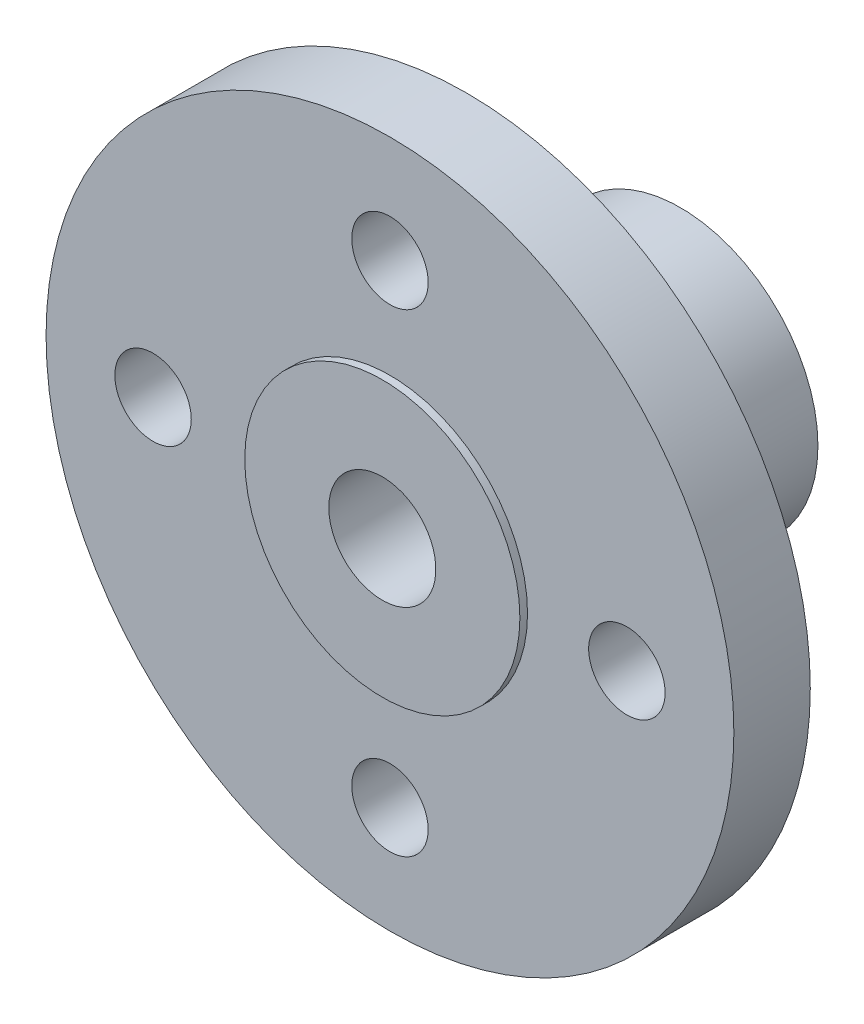
ISO-10303-21;
HEADER;
FILE_DESCRIPTION(('STEP AP214'),'2;1');
FILE_NAME('part.step','',(''),(''),'','','');
FILE_SCHEMA(('AUTOMOTIVE_DESIGN { 1 0 10303 214 1 1 1 1 }'));
ENDSEC;
DATA;
#1=APPLICATION_CONTEXT('core data for automotive mechanical design processes');
#2=APPLICATION_PROTOCOL_DEFINITION('international standard','automotive_design',2000,#1);
#3=PRODUCT_CONTEXT('',#1,'mechanical');
#4=PRODUCT('Part','Part','',(#3));
#5=PRODUCT_RELATED_PRODUCT_CATEGORY('part','',(#4));
#6=PRODUCT_DEFINITION_FORMATION('','',#4);
#7=PRODUCT_DEFINITION_CONTEXT('part definition',#1,'design');
#8=PRODUCT_DEFINITION('design','',#6,#7);
#9=PRODUCT_DEFINITION_SHAPE('','',#8);
#10=(LENGTH_UNIT() NAMED_UNIT(*) SI_UNIT(.MILLI.,.METRE.));
#11=(NAMED_UNIT(*) PLANE_ANGLE_UNIT() SI_UNIT($,.RADIAN.));
#12=(NAMED_UNIT(*) SI_UNIT($,.STERADIAN.) SOLID_ANGLE_UNIT());
#13=UNCERTAINTY_MEASURE_WITH_UNIT(LENGTH_MEASURE(1.E-05),#10,'distance_accuracy_value','');
#14=(GEOMETRIC_REPRESENTATION_CONTEXT(3) GLOBAL_UNCERTAINTY_ASSIGNED_CONTEXT((#13)) GLOBAL_UNIT_ASSIGNED_CONTEXT((#10,
#11,#12)) REPRESENTATION_CONTEXT('',''));
#15=CARTESIAN_POINT('',(0.,0.,0.));
#16=DIRECTION('',(0.,0.,1.));
#17=DIRECTION('',(1.,0.,0.));
#18=AXIS2_PLACEMENT_3D('',#15,#16,#17);
#19=CARTESIAN_POINT('',(0.,0.,2.2));
#20=DIRECTION('',(0.,0.,-1.));
#21=DIRECTION('',(-1.,0.,0.));
#22=AXIS2_PLACEMENT_3D('',#19,#20,#21);
#23=CYLINDRICAL_SURFACE('',#22,3.6);
#24=CARTESIAN_POINT('',(0.,0.,-5.6));
#25=DIRECTION('',(0.,0.,-1.));
#26=DIRECTION('',(-1.,0.,0.));
#27=AXIS2_PLACEMENT_3D('',#24,#25,#26);
#28=CIRCLE('',#27,3.6);
#29=CARTESIAN_POINT('',(-3.6,0.,-5.6));
#30=VERTEX_POINT('',#29);
#31=EDGE_CURVE('E83',#30,#30,#28,.T.);
#32=ORIENTED_EDGE('',*,*,#31,.F.);
#33=EDGE_LOOP('',(#32));
#34=FACE_BOUND('',#33,.T.);
#35=CARTESIAN_POINT('',(0.,0.,0.));
#36=DIRECTION('',(0.,0.,1.));
#37=DIRECTION('',(1.,0.,0.));
#38=AXIS2_PLACEMENT_3D('',#35,#36,#37);
#39=CIRCLE('',#38,3.6);
#40=CARTESIAN_POINT('',(3.6,0.,0.));
#41=VERTEX_POINT('',#40);
#42=EDGE_CURVE('E56',#41,#41,#39,.T.);
#43=ORIENTED_EDGE('',*,*,#42,.F.);
#44=EDGE_LOOP('',(#43));
#45=FACE_BOUND('',#44,.T.);
#46=ADVANCED_FACE('F30',(#34,#45),#23,.T.);
#47=CARTESIAN_POINT('',(0.,0.,2.));
#48=DIRECTION('',(0.,0.,1.));
#49=DIRECTION('',(1.,0.,0.));
#50=AXIS2_PLACEMENT_3D('',#47,#48,#49);
#51=CIRCLE('',#50,3.6);
#52=CARTESIAN_POINT('',(3.6,0.,2.));
#53=VERTEX_POINT('',#52);
#54=EDGE_CURVE('E10',#53,#53,#51,.T.);
#55=ORIENTED_EDGE('',*,*,#54,.T.);
#56=EDGE_LOOP('',(#55));
#57=FACE_BOUND('',#56,.T.);
#58=CARTESIAN_POINT('',(0.,0.,2.2));
#59=DIRECTION('',(0.,0.,-1.));
#60=DIRECTION('',(-1.,0.,0.));
#61=AXIS2_PLACEMENT_3D('',#58,#59,#60);
#62=CIRCLE('',#61,3.6);
#63=CARTESIAN_POINT('',(-3.6,0.,2.2));
#64=VERTEX_POINT('',#63);
#65=EDGE_CURVE('E47',#64,#64,#62,.T.);
#66=ORIENTED_EDGE('',*,*,#65,.T.);
#67=EDGE_LOOP('',(#66));
#68=FACE_BOUND('',#67,.T.);
#69=ADVANCED_FACE('F109',(#57,#68),#23,.T.);
#70=CARTESIAN_POINT('',(0.,0.,2.2));
#71=DIRECTION('',(0.,0.,-1.));
#72=DIRECTION('',(-1.,0.,0.));
#73=AXIS2_PLACEMENT_3D('',#70,#71,#72);
#74=PLANE('',#73);
#75=CARTESIAN_POINT('',(0.,0.,2.2));
#76=DIRECTION('',(0.,0.,-1.));
#77=DIRECTION('',(-1.,0.,0.));
#78=AXIS2_PLACEMENT_3D('',#75,#76,#77);
#79=CIRCLE('',#78,1.4);
#80=CARTESIAN_POINT('',(-1.4,0.,2.2));
#81=VERTEX_POINT('',#80);
#82=EDGE_CURVE('E79',#81,#81,#79,.T.);
#83=ORIENTED_EDGE('',*,*,#82,.T.);
#84=EDGE_LOOP('',(#83));
#85=FACE_BOUND('',#84,.T.);
#86=ORIENTED_EDGE('',*,*,#65,.F.);
#87=EDGE_LOOP('',(#86));
#88=FACE_BOUND('',#87,.T.);
#89=ADVANCED_FACE('F114',(#85,#88),#74,.F.);
#90=CARTESIAN_POINT('',(0.,0.,2.2));
#91=DIRECTION('',(0.,0.,-1.));
#92=DIRECTION('',(-1.,0.,0.));
#93=AXIS2_PLACEMENT_3D('',#90,#91,#92);
#94=CYLINDRICAL_SURFACE('',#93,1.4);
#95=CARTESIAN_POINT('',(0.,0.,0.));
#96=DIRECTION('',(0.,0.,1.));
#97=DIRECTION('',(1.,0.,0.));
#98=AXIS2_PLACEMENT_3D('',#95,#96,#97);
#99=CIRCLE('',#98,1.4);
#100=CARTESIAN_POINT('',(1.4,0.,0.));
#101=VERTEX_POINT('',#100);
#102=EDGE_CURVE('E34',#101,#101,#99,.F.);
#103=ORIENTED_EDGE('',*,*,#102,.T.);
#104=EDGE_LOOP('',(#103));
#105=FACE_BOUND('',#104,.T.);
#106=ORIENTED_EDGE('',*,*,#82,.F.);
#107=EDGE_LOOP('',(#106));
#108=FACE_BOUND('',#107,.T.);
#109=ADVANCED_FACE('F103',(#105,#108),#94,.F.);
#110=CARTESIAN_POINT('',(0.,0.,-5.6));
#111=DIRECTION('',(0.,0.,-1.));
#112=DIRECTION('',(-1.,0.,0.));
#113=AXIS2_PLACEMENT_3D('',#110,#111,#112);
#114=PLANE('',#113);
#115=CARTESIAN_POINT('',(0.,0.,-5.6));
#116=DIRECTION('',(0.,0.,-1.));
#117=DIRECTION('',(-1.,0.,0.));
#118=AXIS2_PLACEMENT_3D('',#115,#116,#117);
#119=CIRCLE('',#118,2.75);
#120=CARTESIAN_POINT('',(-2.75,0.,-5.6));
#121=VERTEX_POINT('',#120);
#122=EDGE_CURVE('E92',#121,#121,#119,.T.);
#123=ORIENTED_EDGE('',*,*,#122,.F.);
#124=EDGE_LOOP('',(#123));
#125=FACE_BOUND('',#124,.T.);
#126=ORIENTED_EDGE('',*,*,#31,.T.);
#127=EDGE_LOOP('',(#126));
#128=FACE_BOUND('',#127,.T.);
#129=ADVANCED_FACE('F99',(#125,#128),#114,.T.);
#130=CARTESIAN_POINT('',(0.,0.,2.));
#131=DIRECTION('',(0.,0.,1.));
#132=DIRECTION('',(1.,0.,0.));
#133=AXIS2_PLACEMENT_3D('',#130,#131,#132);
#134=PLANE('',#133);
#135=ORIENTED_EDGE('',*,*,#54,.F.);
#136=EDGE_LOOP('',(#135));
#137=FACE_BOUND('',#136,.T.);
#138=CARTESIAN_POINT('',(7.74480821064046E-13,-6.2,2.));
#139=DIRECTION('',(0.,0.,1.));
#140=DIRECTION('',(1.,0.,0.));
#141=AXIS2_PLACEMENT_3D('',#138,#139,#140);
#142=CIRCLE('',#141,1.);
#143=CARTESIAN_POINT('',(1.00000000000077,-6.2,2.));
#144=VERTEX_POINT('',#143);
#145=EDGE_CURVE('E57',#144,#144,#142,.T.);
#146=ORIENTED_EDGE('',*,*,#145,.F.);
#147=EDGE_LOOP('',(#146));
#148=FACE_BOUND('',#147,.T.);
#149=CARTESIAN_POINT('',(0.,6.2,2.));
#150=DIRECTION('',(0.,0.,1.));
#151=DIRECTION('',(1.,0.,0.));
#152=AXIS2_PLACEMENT_3D('',#149,#150,#151);
#153=CIRCLE('',#152,1.);
#154=CARTESIAN_POINT('',(1.,6.2,2.));
#155=VERTEX_POINT('',#154);
#156=EDGE_CURVE('E69',#155,#155,#153,.T.);
#157=ORIENTED_EDGE('',*,*,#156,.F.);
#158=EDGE_LOOP('',(#157));
#159=FACE_BOUND('',#158,.T.);
#160=CARTESIAN_POINT('',(0.,0.,2.));
#161=DIRECTION('',(0.,0.,1.));
#162=DIRECTION('',(1.,0.,0.));
#163=AXIS2_PLACEMENT_3D('',#160,#161,#162);
#164=CIRCLE('',#163,9.);
#165=CARTESIAN_POINT('',(9.,0.,2.));
#166=VERTEX_POINT('',#165);
#167=EDGE_CURVE('E38',#166,#166,#164,.T.);
#168=ORIENTED_EDGE('',*,*,#167,.T.);
#169=EDGE_LOOP('',(#168));
#170=FACE_BOUND('',#169,.T.);
#171=CARTESIAN_POINT('',(6.20000000000039,3.87240410532023E-13,2.));
#172=DIRECTION('',(0.,0.,1.));
#173=DIRECTION('',(1.,0.,0.));
#174=AXIS2_PLACEMENT_3D('',#171,#172,#173);
#175=CIRCLE('',#174,1.);
#176=CARTESIAN_POINT('',(7.20000000000039,3.87240410532023E-13,2.));
#177=VERTEX_POINT('',#176);
#178=EDGE_CURVE('E63',#177,#177,#175,.T.);
#179=ORIENTED_EDGE('',*,*,#178,.F.);
#180=EDGE_LOOP('',(#179));
#181=FACE_BOUND('',#180,.T.);
#182=CARTESIAN_POINT('',(-6.19999999999961,-3.87999691547494E-13,2.));
#183=DIRECTION('',(0.,0.,1.));
#184=DIRECTION('',(1.,0.,0.));
#185=AXIS2_PLACEMENT_3D('',#182,#183,#184);
#186=CIRCLE('',#185,1.);
#187=CARTESIAN_POINT('',(-5.19999999999961,-3.87999691547494E-13,2.));
#188=VERTEX_POINT('',#187);
#189=EDGE_CURVE('E49',#188,#188,#186,.T.);
#190=ORIENTED_EDGE('',*,*,#189,.F.);
#191=EDGE_LOOP('',(#190));
#192=FACE_BOUND('',#191,.T.);
#193=ADVANCED_FACE('F102',(#137,#148,#159,#170,#181,#192),#134,.T.);
#194=CARTESIAN_POINT('',(0.,0.,0.));
#195=DIRECTION('',(0.,0.,1.));
#196=DIRECTION('',(1.,0.,0.));
#197=AXIS2_PLACEMENT_3D('',#194,#195,#196);
#198=PLANE('',#197);
#199=ORIENTED_EDGE('',*,*,#42,.T.);
#200=EDGE_LOOP('',(#199));
#201=FACE_BOUND('',#200,.T.);
#202=CARTESIAN_POINT('',(7.74480821064046E-13,-6.2,0.));
#203=DIRECTION('',(0.,0.,1.));
#204=DIRECTION('',(1.,0.,0.));
#205=AXIS2_PLACEMENT_3D('',#202,#203,#204);
#206=CIRCLE('',#205,1.);
#207=CARTESIAN_POINT('',(1.00000000000077,-6.2,0.));
#208=VERTEX_POINT('',#207);
#209=EDGE_CURVE('E52',#208,#208,#206,.T.);
#210=ORIENTED_EDGE('',*,*,#209,.T.);
#211=EDGE_LOOP('',(#210));
#212=FACE_BOUND('',#211,.T.);
#213=CARTESIAN_POINT('',(0.,6.2,0.));
#214=DIRECTION('',(0.,0.,1.));
#215=DIRECTION('',(1.,0.,0.));
#216=AXIS2_PLACEMENT_3D('',#213,#214,#215);
#217=CIRCLE('',#216,1.);
#218=CARTESIAN_POINT('',(1.,6.2,0.));
#219=VERTEX_POINT('',#218);
#220=EDGE_CURVE('E66',#219,#219,#217,.T.);
#221=ORIENTED_EDGE('',*,*,#220,.T.);
#222=EDGE_LOOP('',(#221));
#223=FACE_BOUND('',#222,.T.);
#224=CARTESIAN_POINT('',(0.,0.,0.));
#225=DIRECTION('',(0.,0.,1.));
#226=DIRECTION('',(1.,0.,0.));
#227=AXIS2_PLACEMENT_3D('',#224,#225,#226);
#228=CIRCLE('',#227,9.);
#229=CARTESIAN_POINT('',(9.,0.,0.));
#230=VERTEX_POINT('',#229);
#231=EDGE_CURVE('E43',#230,#230,#228,.T.);
#232=ORIENTED_EDGE('',*,*,#231,.F.);
#233=EDGE_LOOP('',(#232));
#234=FACE_BOUND('',#233,.T.);
#235=CARTESIAN_POINT('',(6.20000000000039,3.87240410532023E-13,0.));
#236=DIRECTION('',(0.,0.,1.));
#237=DIRECTION('',(1.,0.,0.));
#238=AXIS2_PLACEMENT_3D('',#235,#236,#237);
#239=CIRCLE('',#238,1.);
#240=CARTESIAN_POINT('',(7.20000000000039,3.87240410532023E-13,0.));
#241=VERTEX_POINT('',#240);
#242=EDGE_CURVE('E60',#241,#241,#239,.T.);
#243=ORIENTED_EDGE('',*,*,#242,.T.);
#244=EDGE_LOOP('',(#243));
#245=FACE_BOUND('',#244,.T.);
#246=CARTESIAN_POINT('',(-6.19999999999961,-3.87999691547494E-13,0.));
#247=DIRECTION('',(0.,0.,1.));
#248=DIRECTION('',(1.,0.,0.));
#249=AXIS2_PLACEMENT_3D('',#246,#247,#248);
#250=CIRCLE('',#249,1.);
#251=CARTESIAN_POINT('',(-5.19999999999961,-3.87999691547494E-13,0.));
#252=VERTEX_POINT('',#251);
#253=EDGE_CURVE('E53',#252,#252,#250,.T.);
#254=ORIENTED_EDGE('',*,*,#253,.T.);
#255=EDGE_LOOP('',(#254));
#256=FACE_BOUND('',#255,.T.);
#257=ADVANCED_FACE('F136',(#201,#212,#223,#234,#245,#256),#198,.F.);
#258=CARTESIAN_POINT('',(0.,0.,2.));
#259=DIRECTION('',(0.,0.,-1.));
#260=DIRECTION('',(-1.,0.,0.));
#261=AXIS2_PLACEMENT_3D('',#258,#259,#260);
#262=CYLINDRICAL_SURFACE('',#261,9.);
#263=ORIENTED_EDGE('',*,*,#167,.F.);
#264=EDGE_LOOP('',(#263));
#265=FACE_BOUND('',#264,.T.);
#266=ORIENTED_EDGE('',*,*,#231,.T.);
#267=EDGE_LOOP('',(#266));
#268=FACE_BOUND('',#267,.T.);
#269=ADVANCED_FACE('F32',(#265,#268),#262,.T.);
#270=CARTESIAN_POINT('',(0.,6.2,2.));
#271=DIRECTION('',(0.,0.,-1.));
#272=DIRECTION('',(-1.,0.,0.));
#273=AXIS2_PLACEMENT_3D('',#270,#271,#272);
#274=CYLINDRICAL_SURFACE('',#273,1.);
#275=ORIENTED_EDGE('',*,*,#156,.T.);
#276=EDGE_LOOP('',(#275));
#277=FACE_BOUND('',#276,.T.);
#278=ORIENTED_EDGE('',*,*,#220,.F.);
#279=EDGE_LOOP('',(#278));
#280=FACE_BOUND('',#279,.T.);
#281=ADVANCED_FACE('F130',(#277,#280),#274,.F.);
#282=CARTESIAN_POINT('',(6.20000000000039,3.87240410532023E-13,2.));
#283=DIRECTION('',(0.,0.,-1.));
#284=DIRECTION('',(-1.,0.,0.));
#285=AXIS2_PLACEMENT_3D('',#282,#283,#284);
#286=CYLINDRICAL_SURFACE('',#285,1.);
#287=ORIENTED_EDGE('',*,*,#178,.T.);
#288=EDGE_LOOP('',(#287));
#289=FACE_BOUND('',#288,.T.);
#290=ORIENTED_EDGE('',*,*,#242,.F.);
#291=EDGE_LOOP('',(#290));
#292=FACE_BOUND('',#291,.T.);
#293=ADVANCED_FACE('F126',(#289,#292),#286,.F.);
#294=CARTESIAN_POINT('',(7.74480821064046E-13,-6.2,2.));
#295=DIRECTION('',(0.,0.,-1.));
#296=DIRECTION('',(-1.,0.,0.));
#297=AXIS2_PLACEMENT_3D('',#294,#295,#296);
#298=CYLINDRICAL_SURFACE('',#297,1.);
#299=ORIENTED_EDGE('',*,*,#145,.T.);
#300=EDGE_LOOP('',(#299));
#301=FACE_BOUND('',#300,.T.);
#302=ORIENTED_EDGE('',*,*,#209,.F.);
#303=EDGE_LOOP('',(#302));
#304=FACE_BOUND('',#303,.T.);
#305=ADVANCED_FACE('F122',(#301,#304),#298,.F.);
#306=CARTESIAN_POINT('',(-6.19999999999961,-3.87999691547494E-13,2.));
#307=DIRECTION('',(0.,0.,-1.));
#308=DIRECTION('',(-1.,0.,0.));
#309=AXIS2_PLACEMENT_3D('',#306,#307,#308);
#310=CYLINDRICAL_SURFACE('',#309,1.);
#311=ORIENTED_EDGE('',*,*,#189,.T.);
#312=EDGE_LOOP('',(#311));
#313=FACE_BOUND('',#312,.T.);
#314=ORIENTED_EDGE('',*,*,#253,.F.);
#315=EDGE_LOOP('',(#314));
#316=FACE_BOUND('',#315,.T.);
#317=ADVANCED_FACE('F118',(#313,#316),#310,.F.);
#318=CARTESIAN_POINT('',(0.,0.,0.));
#319=DIRECTION('',(0.,0.,1.));
#320=DIRECTION('',(1.,0.,0.));
#321=AXIS2_PLACEMENT_3D('',#318,#319,#320);
#322=PLANE('',#321);
#323=CARTESIAN_POINT('',(0.,0.,0.));
#324=DIRECTION('',(0.,0.,1.));
#325=DIRECTION('',(1.,0.,0.));
#326=AXIS2_PLACEMENT_3D('',#323,#324,#325);
#327=CIRCLE('',#326,2.75);
#328=CARTESIAN_POINT('',(-2.75,0.,0.));
#329=VERTEX_POINT('',#328);
#330=EDGE_CURVE('E89',#329,#329,#327,.F.);
#331=ORIENTED_EDGE('',*,*,#330,.T.);
#332=EDGE_LOOP('',(#331));
#333=FACE_BOUND('',#332,.T.);
#334=ORIENTED_EDGE('',*,*,#102,.F.);
#335=EDGE_LOOP('',(#334));
#336=FACE_BOUND('',#335,.T.);
#337=ADVANCED_FACE('F121',(#333,#336),#322,.F.);
#338=CARTESIAN_POINT('',(0.,0.,7.77817459305202));
#339=DIRECTION('',(0.,0.,-1.));
#340=DIRECTION('',(-1.,0.,0.));
#341=AXIS2_PLACEMENT_3D('',#338,#339,#340);
#342=CYLINDRICAL_SURFACE('',#341,2.75);
#343=CARTESIAN_POINT('',(-2.75,0.,-5.6));
#344=CARTESIAN_POINT('',(-2.75,0.,-5.54166666666667));
#345=CARTESIAN_POINT('',(-2.75,0.,-5.48333333333333));
#346=CARTESIAN_POINT('',(-2.75,0.,-5.36666666666667));
#347=CARTESIAN_POINT('',(-2.75,0.,-5.30833333333333));
#348=CARTESIAN_POINT('',(-2.75,0.,-5.19166666666667));
#349=CARTESIAN_POINT('',(-2.75,0.,-5.13333333333333));
#350=CARTESIAN_POINT('',(-2.75,0.,-5.01666666666667));
#351=CARTESIAN_POINT('',(-2.75,0.,-4.95833333333333));
#352=CARTESIAN_POINT('',(-2.75,0.,-4.84166666666667));
#353=CARTESIAN_POINT('',(-2.75,0.,-4.78333333333333));
#354=CARTESIAN_POINT('',(-2.75,0.,-4.66666666666667));
#355=CARTESIAN_POINT('',(-2.75,0.,-4.60833333333333));
#356=CARTESIAN_POINT('',(-2.75,0.,-4.49166666666667));
#357=CARTESIAN_POINT('',(-2.75,0.,-4.43333333333333));
#358=CARTESIAN_POINT('',(-2.75,0.,-4.31666666666667));
#359=CARTESIAN_POINT('',(-2.75,0.,-4.25833333333333));
#360=CARTESIAN_POINT('',(-2.75,0.,-4.14166666666667));
#361=CARTESIAN_POINT('',(-2.75,0.,-4.08333333333333));
#362=CARTESIAN_POINT('',(-2.75,0.,-3.96666666666667));
#363=CARTESIAN_POINT('',(-2.75,0.,-3.90833333333333));
#364=CARTESIAN_POINT('',(-2.75,0.,-3.79166666666667));
#365=CARTESIAN_POINT('',(-2.75,0.,-3.73333333333333));
#366=CARTESIAN_POINT('',(-2.75,0.,-3.61666666666667));
#367=CARTESIAN_POINT('',(-2.75,0.,-3.55833333333333));
#368=CARTESIAN_POINT('',(-2.75,0.,-3.44166666666667));
#369=CARTESIAN_POINT('',(-2.75,0.,-3.38333333333333));
#370=CARTESIAN_POINT('',(-2.75,0.,-3.26666666666667));
#371=CARTESIAN_POINT('',(-2.75,0.,-3.20833333333333));
#372=CARTESIAN_POINT('',(-2.75,0.,-3.09166666666667));
#373=CARTESIAN_POINT('',(-2.75,0.,-3.03333333333333));
#374=CARTESIAN_POINT('',(-2.75,0.,-2.91666666666667));
#375=CARTESIAN_POINT('',(-2.75,0.,-2.85833333333333));
#376=CARTESIAN_POINT('',(-2.75,0.,-2.74166666666667));
#377=CARTESIAN_POINT('',(-2.75,0.,-2.68333333333333));
#378=CARTESIAN_POINT('',(-2.75,0.,-2.56666666666667));
#379=CARTESIAN_POINT('',(-2.75,0.,-2.50833333333333));
#380=CARTESIAN_POINT('',(-2.75,0.,-2.39166666666667));
#381=CARTESIAN_POINT('',(-2.75,0.,-2.33333333333333));
#382=CARTESIAN_POINT('',(-2.75,0.,-2.21666666666667));
#383=CARTESIAN_POINT('',(-2.75,0.,-2.15833333333333));
#384=CARTESIAN_POINT('',(-2.75,0.,-2.04166666666667));
#385=CARTESIAN_POINT('',(-2.75,0.,-1.98333333333333));
#386=CARTESIAN_POINT('',(-2.75,0.,-1.86666666666667));
#387=CARTESIAN_POINT('',(-2.75,0.,-1.80833333333333));
#388=CARTESIAN_POINT('',(-2.75,0.,-1.69166666666667));
#389=CARTESIAN_POINT('',(-2.75,0.,-1.63333333333333));
#390=CARTESIAN_POINT('',(-2.75,0.,-1.51666666666667));
#391=CARTESIAN_POINT('',(-2.75,0.,-1.45833333333333));
#392=CARTESIAN_POINT('',(-2.75,0.,-1.34166666666667));
#393=CARTESIAN_POINT('',(-2.75,0.,-1.28333333333333));
#394=CARTESIAN_POINT('',(-2.75,0.,-1.16666666666667));
#395=CARTESIAN_POINT('',(-2.75,0.,-1.10833333333333));
#396=CARTESIAN_POINT('',(-2.75,0.,-0.991666666666666));
#397=CARTESIAN_POINT('',(-2.75,0.,-0.933333333333333));
#398=CARTESIAN_POINT('',(-2.75,0.,-0.816666666666666));
#399=CARTESIAN_POINT('',(-2.75,0.,-0.758333333333332));
#400=CARTESIAN_POINT('',(-2.75,0.,-0.641666666666666));
#401=CARTESIAN_POINT('',(-2.75,0.,-0.583333333333333));
#402=CARTESIAN_POINT('',(-2.75,0.,-0.466666666666666));
#403=CARTESIAN_POINT('',(-2.75,0.,-0.408333333333333));
#404=CARTESIAN_POINT('',(-2.75,0.,-0.291666666666666));
#405=CARTESIAN_POINT('',(-2.75,0.,-0.233333333333332));
#406=CARTESIAN_POINT('',(-2.75,0.,-0.116666666666666));
#407=CARTESIAN_POINT('',(-2.75,0.,-0.058333333333333));
#408=CARTESIAN_POINT('',(-2.75,0.,0.));
#409=B_SPLINE_CURVE_WITH_KNOTS('',3,(#343,#344,#345,#346,#347,#348,#349,#350,#351,#352,#353,
#354,#355,#356,#357,#358,#359,#360,#361,#362,#363,#364,#365,#366,#367,#368,#369,#370,#371,#372,
#373,#374,#375,#376,#377,#378,#379,#380,#381,#382,#383,#384,#385,#386,#387,#388,#389,#390,#391,
#392,#393,#394,#395,#396,#397,#398,#399,#400,#401,#402,#403,#404,#405,#406,#407,#408),
.UNSPECIFIED.,.F.,.F.,(4,2,2,2,2,2,2,2,2,2,2,2,2,2,2,2,2,2,2,2,2,2,2,2,2,2,2,2,2,2,2,2,4),(0.,
0.175,0.35,0.524999999999999,0.699999999999999,0.875000000000001,1.05,1.225,1.4,1.575,1.75,
1.925,2.1,2.275,2.45,2.625,2.8,2.975,3.15,3.325,3.5,3.675,3.85,4.025,4.2,4.375,4.55,4.725,4.9,
5.075,5.25,5.425,5.6),.UNSPECIFIED.);
#410=EDGE_CURVE('BSEAM96',#121,#329,#409,.T.);
#411=ORIENTED_EDGE('',*,*,#122,.T.);
#412=ORIENTED_EDGE('',*,*,#330,.F.);
#413=ORIENTED_EDGE('',*,*,#410,.T.);
#414=ORIENTED_EDGE('',*,*,#410,.F.);
#415=EDGE_LOOP('',(#411,#413,#412,#414));
#416=FACE_BOUND('',#415,.T.);
#417=ADVANCED_FACE('F96',(#416),#342,.F.);
#418=CLOSED_SHELL('',(#46,#69,#89,#109,#129,#193,#257,#269,#281,#293,#305,#317,#337,#417));
#419=MANIFOLD_SOLID_BREP('B2',#418);
#420=ADVANCED_BREP_SHAPE_REPRESENTATION('',(#18,#419),#14);
#421=SHAPE_DEFINITION_REPRESENTATION(#9,#420);
ENDSEC;
END-ISO-10303-21;
